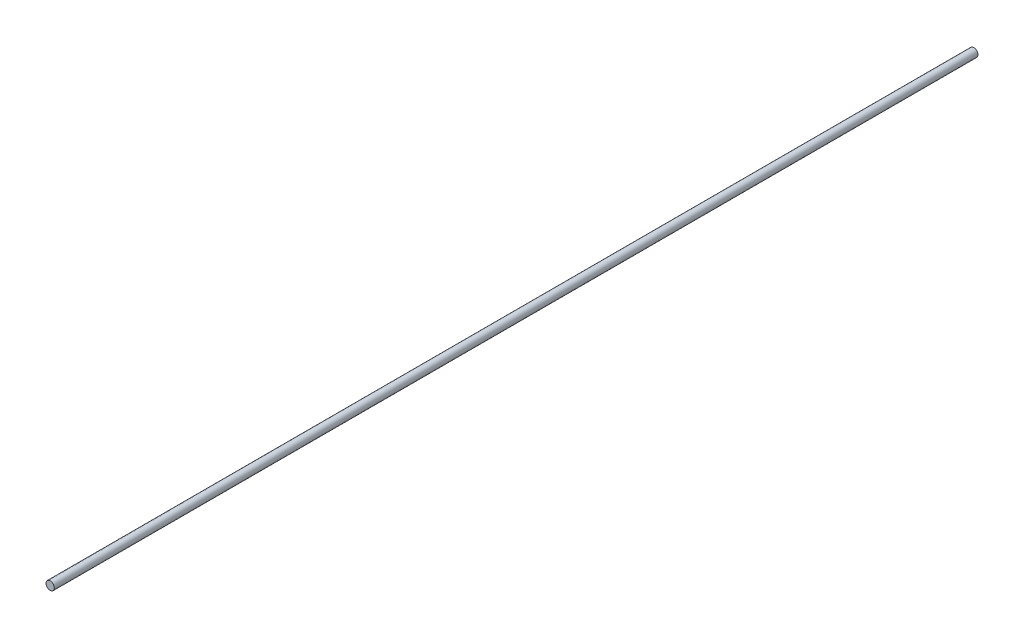
ISO-10303-21;
HEADER;
FILE_DESCRIPTION(('STEP AP214'),'2;1');
FILE_NAME('part.step','',(''),(''),'','','');
FILE_SCHEMA(('AUTOMOTIVE_DESIGN { 1 0 10303 214 1 1 1 1 }'));
ENDSEC;
DATA;
#1=APPLICATION_CONTEXT('core data for automotive mechanical design processes');
#2=APPLICATION_PROTOCOL_DEFINITION('international standard','automotive_design',2000,#1);
#3=PRODUCT_CONTEXT('',#1,'mechanical');
#4=PRODUCT('Part','Part','',(#3));
#5=PRODUCT_RELATED_PRODUCT_CATEGORY('part','',(#4));
#6=PRODUCT_DEFINITION_FORMATION('','',#4);
#7=PRODUCT_DEFINITION_CONTEXT('part definition',#1,'design');
#8=PRODUCT_DEFINITION('design','',#6,#7);
#9=PRODUCT_DEFINITION_SHAPE('','',#8);
#10=(LENGTH_UNIT() NAMED_UNIT(*) SI_UNIT(.MILLI.,.METRE.));
#11=(NAMED_UNIT(*) PLANE_ANGLE_UNIT() SI_UNIT($,.RADIAN.));
#12=(NAMED_UNIT(*) SI_UNIT($,.STERADIAN.) SOLID_ANGLE_UNIT());
#13=UNCERTAINTY_MEASURE_WITH_UNIT(LENGTH_MEASURE(1.E-05),#10,'distance_accuracy_value','');
#14=(GEOMETRIC_REPRESENTATION_CONTEXT(3) GLOBAL_UNCERTAINTY_ASSIGNED_CONTEXT((#13)) GLOBAL_UNIT_ASSIGNED_CONTEXT((#10,
#11,#12)) REPRESENTATION_CONTEXT('',''));
#15=CARTESIAN_POINT('',(0.,0.,0.));
#16=DIRECTION('',(0.,0.,1.));
#17=DIRECTION('',(1.,0.,0.));
#18=AXIS2_PLACEMENT_3D('',#15,#16,#17);
#19=CARTESIAN_POINT('',(0.,0.,1000.));
#20=DIRECTION('',(0.,0.,-1.));
#21=DIRECTION('',(-1.,0.,0.));
#22=AXIS2_PLACEMENT_3D('',#19,#20,#21);
#23=CYLINDRICAL_SURFACE('',#22,9.);
#24=CARTESIAN_POINT('',(0.,0.,1000.));
#25=DIRECTION('',(0.,0.,1.));
#26=DIRECTION('',(1.,0.,0.));
#27=AXIS2_PLACEMENT_3D('',#24,#25,#26);
#28=CIRCLE('',#27,9.);
#29=CARTESIAN_POINT('',(9.,0.,1000.));
#30=VERTEX_POINT('',#29);
#31=EDGE_CURVE('E10',#30,#30,#28,.T.);
#32=ORIENTED_EDGE('',*,*,#31,.F.);
#33=EDGE_LOOP('',(#32));
#34=FACE_BOUND('',#33,.T.);
#35=CARTESIAN_POINT('',(0.,0.,-1000.));
#36=DIRECTION('',(0.,0.,1.));
#37=DIRECTION('',(1.,0.,0.));
#38=AXIS2_PLACEMENT_3D('',#35,#36,#37);
#39=CIRCLE('',#38,9.);
#40=CARTESIAN_POINT('',(9.,0.,-1000.));
#41=VERTEX_POINT('',#40);
#42=EDGE_CURVE('E44',#41,#41,#39,.T.);
#43=ORIENTED_EDGE('',*,*,#42,.T.);
#44=EDGE_LOOP('',(#43));
#45=FACE_BOUND('',#44,.T.);
#46=ADVANCED_FACE('F41',(#34,#45),#23,.T.);
#47=CARTESIAN_POINT('',(0.,0.,1000.));
#48=DIRECTION('',(0.,0.,1.));
#49=DIRECTION('',(1.,0.,0.));
#50=AXIS2_PLACEMENT_3D('',#47,#48,#49);
#51=PLANE('',#50);
#52=ORIENTED_EDGE('',*,*,#31,.T.);
#53=EDGE_LOOP('',(#52));
#54=FACE_BOUND('',#53,.T.);
#55=ADVANCED_FACE('F58',(#54),#51,.T.);
#56=CARTESIAN_POINT('',(0.,0.,-1000.));
#57=DIRECTION('',(0.,0.,1.));
#58=DIRECTION('',(1.,0.,0.));
#59=AXIS2_PLACEMENT_3D('',#56,#57,#58);
#60=PLANE('',#59);
#61=ORIENTED_EDGE('',*,*,#42,.F.);
#62=EDGE_LOOP('',(#61));
#63=FACE_BOUND('',#62,.T.);
#64=ADVANCED_FACE('F56',(#63),#60,.F.);
#65=CLOSED_SHELL('',(#46,#55,#64));
#66=MANIFOLD_SOLID_BREP('B2',#65);
#67=ADVANCED_BREP_SHAPE_REPRESENTATION('',(#18,#66),#14);
#68=SHAPE_DEFINITION_REPRESENTATION(#9,#67);
ENDSEC;
END-ISO-10303-21;
